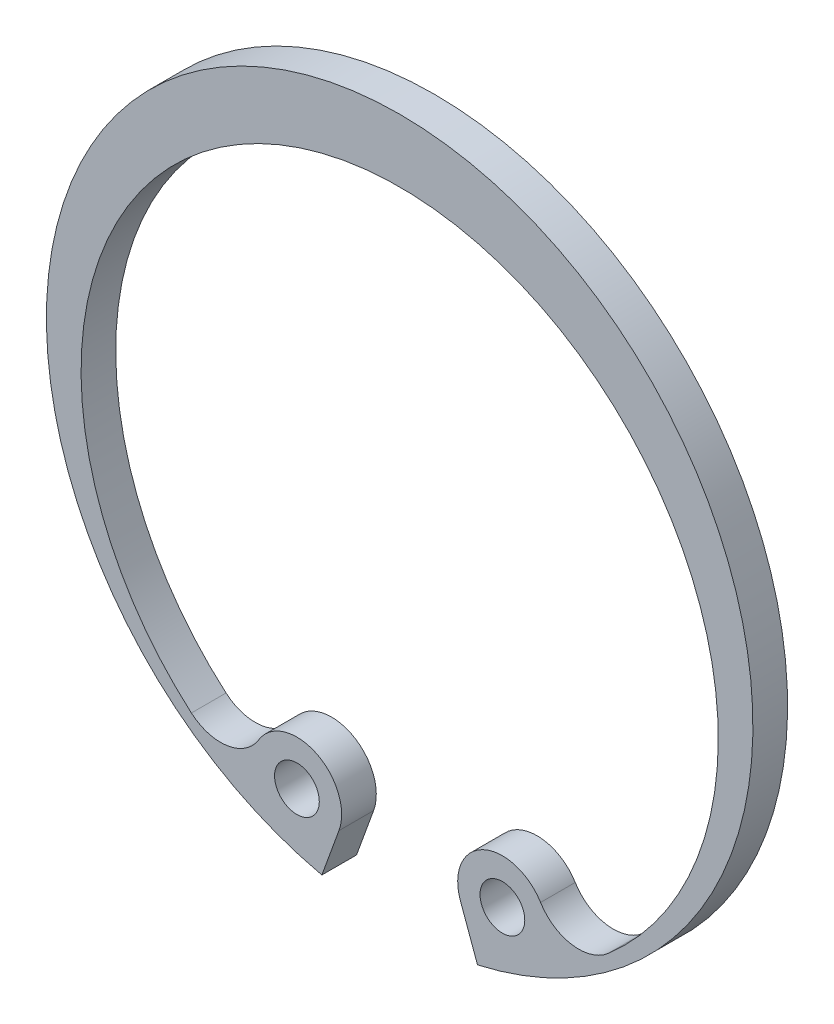
ISO-10303-21;
HEADER;
FILE_DESCRIPTION(('STEP AP214'),'2;1');
FILE_NAME('part.step','',(''),(''),'','','');
FILE_SCHEMA(('AUTOMOTIVE_DESIGN { 1 0 10303 214 1 1 1 1 }'));
ENDSEC;
DATA;
#1=APPLICATION_CONTEXT('core data for automotive mechanical design processes');
#2=APPLICATION_PROTOCOL_DEFINITION('international standard','automotive_design',2000,#1);
#3=PRODUCT_CONTEXT('',#1,'mechanical');
#4=PRODUCT('Part','Part','',(#3));
#5=PRODUCT_RELATED_PRODUCT_CATEGORY('part','',(#4));
#6=PRODUCT_DEFINITION_FORMATION('','',#4);
#7=PRODUCT_DEFINITION_CONTEXT('part definition',#1,'design');
#8=PRODUCT_DEFINITION('design','',#6,#7);
#9=PRODUCT_DEFINITION_SHAPE('','',#8);
#10=(LENGTH_UNIT() NAMED_UNIT(*) SI_UNIT(.MILLI.,.METRE.));
#11=(NAMED_UNIT(*) PLANE_ANGLE_UNIT() SI_UNIT($,.RADIAN.));
#12=(NAMED_UNIT(*) SI_UNIT($,.STERADIAN.) SOLID_ANGLE_UNIT());
#13=UNCERTAINTY_MEASURE_WITH_UNIT(LENGTH_MEASURE(1.E-05),#10,'distance_accuracy_value','');
#14=(GEOMETRIC_REPRESENTATION_CONTEXT(3) GLOBAL_UNCERTAINTY_ASSIGNED_CONTEXT((#13)) GLOBAL_UNIT_ASSIGNED_CONTEXT((#10,
#11,#12)) REPRESENTATION_CONTEXT('',''));
#15=CARTESIAN_POINT('',(0.,0.,0.));
#16=DIRECTION('',(0.,0.,1.));
#17=DIRECTION('',(1.,0.,0.));
#18=AXIS2_PLACEMENT_3D('',#15,#16,#17);
#19=CARTESIAN_POINT('',(0.,0.,0.775));
#20=DIRECTION('',(0.,0.,-1.));
#21=DIRECTION('',(-1.,0.,0.));
#22=AXIS2_PLACEMENT_3D('',#19,#20,#21);
#23=CYLINDRICAL_SURFACE('',#22,7.9);
#24=CARTESIAN_POINT('',(0.,0.,0.775));
#25=DIRECTION('',(0.,0.,-1.));
#26=DIRECTION('',(-1.,0.,0.));
#27=AXIS2_PLACEMENT_3D('',#24,#25,#26);
#28=CIRCLE('',#27,7.9);
#29=CARTESIAN_POINT('',(-1.74053225299461,-7.70587746309825,0.775));
#30=VERTEX_POINT('',#29);
#31=CARTESIAN_POINT('',(1.74053225299461,-7.70587746309825,0.775));
#32=VERTEX_POINT('',#31);
#33=EDGE_CURVE('E48',#30,#32,#28,.T.);
#34=ORIENTED_EDGE('',*,*,#33,.F.);
#35=DIRECTION('',(0.,0.,-1.));
#36=VECTOR('',#35,1.);
#37=CARTESIAN_POINT('',(-1.74053225299461,-7.70587746309825,1.55));
#38=LINE('',#37,#36);
#39=CARTESIAN_POINT('',(-1.74053225299461,-7.70587746309825,1.55));
#40=VERTEX_POINT('',#39);
#41=EDGE_CURVE('E11',#40,#30,#38,.T.);
#42=ORIENTED_EDGE('',*,*,#41,.F.);
#43=CARTESIAN_POINT('',(0.,0.,1.55));
#44=DIRECTION('',(0.,0.,1.));
#45=DIRECTION('',(1.,0.,0.));
#46=AXIS2_PLACEMENT_3D('',#43,#44,#45);
#47=CIRCLE('',#46,7.9);
#48=CARTESIAN_POINT('',(1.74053225299461,-7.70587746309825,1.55));
#49=VERTEX_POINT('',#48);
#50=EDGE_CURVE('E117',#49,#40,#47,.T.);
#51=ORIENTED_EDGE('',*,*,#50,.F.);
#52=DIRECTION('',(0.,0.,-1.));
#53=VECTOR('',#52,1.);
#54=CARTESIAN_POINT('',(1.74053225299461,-7.70587746309825,1.55));
#55=LINE('',#54,#53);
#56=EDGE_CURVE('E110',#49,#32,#55,.T.);
#57=ORIENTED_EDGE('',*,*,#56,.T.);
#58=EDGE_LOOP('',(#34,#42,#51,#57));
#59=FACE_BOUND('',#58,.T.);
#60=ADVANCED_FACE('F32',(#59),#23,.T.);
#61=CARTESIAN_POINT('',(0.,0.,1.55));
#62=DIRECTION('',(0.,0.,1.));
#63=DIRECTION('',(1.,0.,0.));
#64=AXIS2_PLACEMENT_3D('',#61,#62,#63);
#65=PLANE('',#64);
#66=CARTESIAN_POINT('',(2.29764108844284,-6.31271700850784,1.55));
#67=DIRECTION('',(0.,0.,1.));
#68=DIRECTION('',(1.,0.,0.));
#69=AXIS2_PLACEMENT_3D('',#66,#67,#68);
#70=CIRCLE('',#69,0.5);
#71=CARTESIAN_POINT('',(2.79764108844284,-6.31271700850784,1.55));
#72=VERTEX_POINT('',#71);
#73=EDGE_CURVE('E104',#72,#72,#70,.T.);
#74=ORIENTED_EDGE('',*,*,#73,.F.);
#75=EDGE_LOOP('',(#74));
#76=FACE_BOUND('',#75,.T.);
#77=ORIENTED_EDGE('',*,*,#50,.T.);
#78=DIRECTION('',(0.342020143325667,0.939692620785909,0.));
#79=VECTOR('',#78,1.);
#80=CARTESIAN_POINT('',(-1.35794846765694,-6.65473715183351,1.55));
#81=LINE('',#80,#79);
#82=CARTESIAN_POINT('',(-1.35794846765694,-6.65473715183351,1.55));
#83=VERTEX_POINT('',#82);
#84=EDGE_CURVE('E114',#40,#83,#81,.T.);
#85=ORIENTED_EDGE('',*,*,#84,.T.);
#86=CARTESIAN_POINT('',(-2.29764108844284,-6.31271700850784,1.55));
#87=DIRECTION('',(0.,0.,1.));
#88=DIRECTION('',(1.,0.,0.));
#89=AXIS2_PLACEMENT_3D('',#86,#87,#88);
#90=CIRCLE('',#89,0.999999999999999);
#91=CARTESIAN_POINT('',(-3.15093243026248,-5.7912825581925,1.55));
#92=VERTEX_POINT('',#91);
#93=EDGE_CURVE('E116',#83,#92,#90,.T.);
#94=ORIENTED_EDGE('',*,*,#93,.T.);
#95=CARTESIAN_POINT('',(-4.0042237720821,-5.26984810787717,1.55));
#96=DIRECTION('',(0.,0.,-1.));
#97=DIRECTION('',(1.,0.,0.));
#98=AXIS2_PLACEMENT_3D('',#95,#96,#97);
#99=CIRCLE('',#98,1.);
#100=CARTESIAN_POINT('',(-4.65797459201388,-6.02655800304078,1.55));
#101=VERTEX_POINT('',#100);
#102=EDGE_CURVE('E129',#92,#101,#99,.T.);
#103=ORIENTED_EDGE('',*,*,#102,.T.);
#104=CARTESIAN_POINT('',(0.,-0.635,1.55));
#105=DIRECTION('',(0.,0.,-1.));
#106=DIRECTION('',(1.,0.,0.));
#107=AXIS2_PLACEMENT_3D('',#104,#105,#106);
#108=CIRCLE('',#107,7.125);
#109=CARTESIAN_POINT('',(4.65797459201388,-6.02655800304079,1.55));
#110=VERTEX_POINT('',#109);
#111=EDGE_CURVE('E131',#101,#110,#108,.T.);
#112=ORIENTED_EDGE('',*,*,#111,.T.);
#113=CARTESIAN_POINT('',(4.0042237720821,-5.26984810787717,1.55));
#114=DIRECTION('',(0.,0.,-1.));
#115=DIRECTION('',(-1.,0.,0.));
#116=AXIS2_PLACEMENT_3D('',#113,#114,#115);
#117=CIRCLE('',#116,1.);
#118=CARTESIAN_POINT('',(3.15093243026248,-5.7912825581925,1.55));
#119=VERTEX_POINT('',#118);
#120=EDGE_CURVE('E133',#110,#119,#117,.T.);
#121=ORIENTED_EDGE('',*,*,#120,.T.);
#122=CARTESIAN_POINT('',(2.29764108844284,-6.31271700850784,1.55));
#123=DIRECTION('',(0.,0.,1.));
#124=DIRECTION('',(-1.,0.,0.));
#125=AXIS2_PLACEMENT_3D('',#122,#123,#124);
#126=CIRCLE('',#125,1.);
#127=CARTESIAN_POINT('',(1.35794846765694,-6.65473715183351,1.55));
#128=VERTEX_POINT('',#127);
#129=EDGE_CURVE('E135',#119,#128,#126,.T.);
#130=ORIENTED_EDGE('',*,*,#129,.T.);
#131=DIRECTION('',(0.342020143325669,-0.939692620785908,0.));
#132=VECTOR('',#131,1.);
#133=CARTESIAN_POINT('',(1.35794846765694,-6.65473715183351,1.55));
#134=LINE('',#133,#132);
#135=EDGE_CURVE('E56',#128,#49,#134,.T.);
#136=ORIENTED_EDGE('',*,*,#135,.T.);
#137=EDGE_LOOP('',(#77,#85,#94,#103,#112,#121,#130,#136));
#138=FACE_BOUND('',#137,.T.);
#139=CARTESIAN_POINT('',(-2.29764108844284,-6.31271700850784,1.55));
#140=DIRECTION('',(0.,0.,1.));
#141=DIRECTION('',(1.,0.,0.));
#142=AXIS2_PLACEMENT_3D('',#139,#140,#141);
#143=CIRCLE('',#142,0.5);
#144=CARTESIAN_POINT('',(-1.79764108844284,-6.31271700850784,1.55));
#145=VERTEX_POINT('',#144);
#146=EDGE_CURVE('E228',#145,#145,#143,.T.);
#147=ORIENTED_EDGE('',*,*,#146,.F.);
#148=EDGE_LOOP('',(#147));
#149=FACE_BOUND('',#148,.T.);
#150=ADVANCED_FACE('F119',(#76,#138,#149),#65,.T.);
#151=CARTESIAN_POINT('',(-1.35794846765694,-6.65473715183351,1.55));
#152=DIRECTION('',(-0.939692620785909,0.342020143325667,0.));
#153=DIRECTION('',(-0.342020143325667,-0.939692620785909,0.));
#154=AXIS2_PLACEMENT_3D('',#151,#152,#153);
#155=PLANE('',#154);
#156=DIRECTION('',(0.342020143325667,0.939692620785909,0.));
#157=VECTOR('',#156,1.);
#158=CARTESIAN_POINT('',(-1.35794846765694,-6.65473715183351,0.775));
#159=LINE('',#158,#157);
#160=CARTESIAN_POINT('',(-1.35794846765694,-6.65473715183351,0.775));
#161=VERTEX_POINT('',#160);
#162=EDGE_CURVE('E97',#30,#161,#159,.T.);
#163=ORIENTED_EDGE('',*,*,#162,.T.);
#164=DIRECTION('',(0.,0.,-1.));
#165=VECTOR('',#164,1.);
#166=CARTESIAN_POINT('',(-1.35794846765694,-6.65473715183351,1.55));
#167=LINE('',#166,#165);
#168=EDGE_CURVE('E40',#83,#161,#167,.T.);
#169=ORIENTED_EDGE('',*,*,#168,.F.);
#170=ORIENTED_EDGE('',*,*,#84,.F.);
#171=ORIENTED_EDGE('',*,*,#41,.T.);
#172=EDGE_LOOP('',(#163,#169,#170,#171));
#173=FACE_BOUND('',#172,.T.);
#174=ADVANCED_FACE('F113',(#173),#155,.F.);
#175=CARTESIAN_POINT('',(-2.29764108844284,-6.31271700850784,1.55));
#176=DIRECTION('',(0.,0.,-1.));
#177=DIRECTION('',(-1.,0.,0.));
#178=AXIS2_PLACEMENT_3D('',#175,#176,#177);
#179=CYLINDRICAL_SURFACE('',#178,0.999999999999999);
#180=CARTESIAN_POINT('',(-2.29764108844284,-6.31271700850784,0.775));
#181=DIRECTION('',(0.,0.,1.));
#182=DIRECTION('',(1.,0.,0.));
#183=AXIS2_PLACEMENT_3D('',#180,#181,#182);
#184=CIRCLE('',#183,0.999999999999999);
#185=CARTESIAN_POINT('',(-3.15093243026247,-5.7912825581925,0.775));
#186=VERTEX_POINT('',#185);
#187=EDGE_CURVE('E100',#161,#186,#184,.T.);
#188=ORIENTED_EDGE('',*,*,#187,.T.);
#189=DIRECTION('',(0.,0.,-1.));
#190=VECTOR('',#189,1.);
#191=CARTESIAN_POINT('',(-3.15093243026248,-5.7912825581925,1.55));
#192=LINE('',#191,#190);
#193=EDGE_CURVE('E171',#92,#186,#192,.T.);
#194=ORIENTED_EDGE('',*,*,#193,.F.);
#195=ORIENTED_EDGE('',*,*,#93,.F.);
#196=ORIENTED_EDGE('',*,*,#168,.T.);
#197=EDGE_LOOP('',(#188,#194,#195,#196));
#198=FACE_BOUND('',#197,.T.);
#199=ADVANCED_FACE('F177',(#198),#179,.T.);
#200=CARTESIAN_POINT('',(-4.0042237720821,-5.26984810787717,1.55));
#201=DIRECTION('',(0.,0.,-1.));
#202=DIRECTION('',(-1.,0.,0.));
#203=AXIS2_PLACEMENT_3D('',#200,#201,#202);
#204=CYLINDRICAL_SURFACE('',#203,1.);
#205=CARTESIAN_POINT('',(-4.0042237720821,-5.26984810787717,0.775));
#206=DIRECTION('',(0.,0.,-1.));
#207=DIRECTION('',(1.,0.,0.));
#208=AXIS2_PLACEMENT_3D('',#205,#206,#207);
#209=CIRCLE('',#208,1.);
#210=CARTESIAN_POINT('',(-4.65797459201388,-6.02655800304078,0.775));
#211=VERTEX_POINT('',#210);
#212=EDGE_CURVE('E139',#186,#211,#209,.T.);
#213=ORIENTED_EDGE('',*,*,#212,.T.);
#214=DIRECTION('',(0.,0.,-1.));
#215=VECTOR('',#214,1.);
#216=CARTESIAN_POINT('',(-4.65797459201388,-6.02655800304078,1.55));
#217=LINE('',#216,#215);
#218=EDGE_CURVE('E166',#101,#211,#217,.T.);
#219=ORIENTED_EDGE('',*,*,#218,.F.);
#220=ORIENTED_EDGE('',*,*,#102,.F.);
#221=ORIENTED_EDGE('',*,*,#193,.T.);
#222=EDGE_LOOP('',(#213,#219,#220,#221));
#223=FACE_BOUND('',#222,.T.);
#224=ADVANCED_FACE('F184',(#223),#204,.F.);
#225=CARTESIAN_POINT('',(0.,-0.635,1.55));
#226=DIRECTION('',(0.,0.,-1.));
#227=DIRECTION('',(-1.,0.,0.));
#228=AXIS2_PLACEMENT_3D('',#225,#226,#227);
#229=CYLINDRICAL_SURFACE('',#228,7.125);
#230=CARTESIAN_POINT('',(0.,-0.635,0.775));
#231=DIRECTION('',(0.,0.,-1.));
#232=DIRECTION('',(1.,0.,0.));
#233=AXIS2_PLACEMENT_3D('',#230,#231,#232);
#234=CIRCLE('',#233,7.125);
#235=CARTESIAN_POINT('',(4.65797459201388,-6.02655800304078,0.775));
#236=VERTEX_POINT('',#235);
#237=EDGE_CURVE('E142',#211,#236,#234,.T.);
#238=ORIENTED_EDGE('',*,*,#237,.T.);
#239=DIRECTION('',(0.,0.,-1.));
#240=VECTOR('',#239,1.);
#241=CARTESIAN_POINT('',(4.65797459201388,-6.02655800304079,1.55));
#242=LINE('',#241,#240);
#243=EDGE_CURVE('E161',#110,#236,#242,.T.);
#244=ORIENTED_EDGE('',*,*,#243,.F.);
#245=ORIENTED_EDGE('',*,*,#111,.F.);
#246=ORIENTED_EDGE('',*,*,#218,.T.);
#247=EDGE_LOOP('',(#238,#244,#245,#246));
#248=FACE_BOUND('',#247,.T.);
#249=ADVANCED_FACE('F186',(#248),#229,.F.);
#250=CARTESIAN_POINT('',(4.0042237720821,-5.26984810787717,1.55));
#251=DIRECTION('',(0.,0.,-1.));
#252=DIRECTION('',(-1.,0.,0.));
#253=AXIS2_PLACEMENT_3D('',#250,#251,#252);
#254=CYLINDRICAL_SURFACE('',#253,1.);
#255=CARTESIAN_POINT('',(4.0042237720821,-5.26984810787717,0.775));
#256=DIRECTION('',(0.,0.,-1.));
#257=DIRECTION('',(-1.,0.,0.));
#258=AXIS2_PLACEMENT_3D('',#255,#256,#257);
#259=CIRCLE('',#258,1.);
#260=CARTESIAN_POINT('',(3.15093243026247,-5.7912825581925,0.775));
#261=VERTEX_POINT('',#260);
#262=EDGE_CURVE('E145',#236,#261,#259,.T.);
#263=ORIENTED_EDGE('',*,*,#262,.T.);
#264=DIRECTION('',(0.,0.,-1.));
#265=VECTOR('',#264,1.);
#266=CARTESIAN_POINT('',(3.15093243026248,-5.7912825581925,1.55));
#267=LINE('',#266,#265);
#268=EDGE_CURVE('E157',#119,#261,#267,.T.);
#269=ORIENTED_EDGE('',*,*,#268,.F.);
#270=ORIENTED_EDGE('',*,*,#120,.F.);
#271=ORIENTED_EDGE('',*,*,#243,.T.);
#272=EDGE_LOOP('',(#263,#269,#270,#271));
#273=FACE_BOUND('',#272,.T.);
#274=ADVANCED_FACE('F189',(#273),#254,.F.);
#275=CARTESIAN_POINT('',(2.29764108844284,-6.31271700850784,1.55));
#276=DIRECTION('',(0.,0.,-1.));
#277=DIRECTION('',(-1.,0.,0.));
#278=AXIS2_PLACEMENT_3D('',#275,#276,#277);
#279=CYLINDRICAL_SURFACE('',#278,1.);
#280=CARTESIAN_POINT('',(2.29764108844284,-6.31271700850784,0.775));
#281=DIRECTION('',(0.,0.,1.));
#282=DIRECTION('',(-1.,0.,0.));
#283=AXIS2_PLACEMENT_3D('',#280,#281,#282);
#284=CIRCLE('',#283,1.);
#285=CARTESIAN_POINT('',(1.35794846765694,-6.65473715183351,0.775));
#286=VERTEX_POINT('',#285);
#287=EDGE_CURVE('E123',#261,#286,#284,.T.);
#288=ORIENTED_EDGE('',*,*,#287,.T.);
#289=DIRECTION('',(0.,0.,-1.));
#290=VECTOR('',#289,1.);
#291=CARTESIAN_POINT('',(1.35794846765694,-6.65473715183351,1.55));
#292=LINE('',#291,#290);
#293=EDGE_CURVE('E152',#128,#286,#292,.T.);
#294=ORIENTED_EDGE('',*,*,#293,.F.);
#295=ORIENTED_EDGE('',*,*,#129,.F.);
#296=ORIENTED_EDGE('',*,*,#268,.T.);
#297=EDGE_LOOP('',(#288,#294,#295,#296));
#298=FACE_BOUND('',#297,.T.);
#299=ADVANCED_FACE('F190',(#298),#279,.T.);
#300=CARTESIAN_POINT('',(1.35794846765694,-6.65473715183351,1.55));
#301=DIRECTION('',(0.939692620785908,0.342020143325669,0.));
#302=DIRECTION('',(-0.342020143325669,0.939692620785908,0.));
#303=AXIS2_PLACEMENT_3D('',#300,#301,#302);
#304=PLANE('',#303);
#305=DIRECTION('',(0.342020143325669,-0.939692620785908,0.));
#306=VECTOR('',#305,1.);
#307=CARTESIAN_POINT('',(1.35794846765694,-6.65473715183351,0.775));
#308=LINE('',#307,#306);
#309=EDGE_CURVE('E121',#286,#32,#308,.T.);
#310=ORIENTED_EDGE('',*,*,#309,.T.);
#311=ORIENTED_EDGE('',*,*,#56,.F.);
#312=ORIENTED_EDGE('',*,*,#135,.F.);
#313=ORIENTED_EDGE('',*,*,#293,.T.);
#314=EDGE_LOOP('',(#310,#311,#312,#313));
#315=FACE_BOUND('',#314,.T.);
#316=ADVANCED_FACE('F191',(#315),#304,.F.);
#317=CARTESIAN_POINT('',(2.29764108844284,-6.31271700850784,1.55));
#318=DIRECTION('',(0.,0.,-1.));
#319=DIRECTION('',(-1.,0.,0.));
#320=AXIS2_PLACEMENT_3D('',#317,#318,#319);
#321=CYLINDRICAL_SURFACE('',#320,0.5);
#322=ORIENTED_EDGE('',*,*,#73,.T.);
#323=EDGE_LOOP('',(#322));
#324=FACE_BOUND('',#323,.T.);
#325=CARTESIAN_POINT('',(2.29764108844284,-6.31271700850784,0.775));
#326=DIRECTION('',(0.,0.,-1.));
#327=DIRECTION('',(-1.,0.,0.));
#328=AXIS2_PLACEMENT_3D('',#325,#326,#327);
#329=CIRCLE('',#328,0.5);
#330=CARTESIAN_POINT('',(1.79764108844284,-6.31271700850784,0.775));
#331=VERTEX_POINT('',#330);
#332=EDGE_CURVE('E226',#331,#331,#329,.T.);
#333=ORIENTED_EDGE('',*,*,#332,.T.);
#334=EDGE_LOOP('',(#333));
#335=FACE_BOUND('',#334,.T.);
#336=ADVANCED_FACE('F193',(#324,#335),#321,.F.);
#337=CARTESIAN_POINT('',(-2.29764108844284,-6.31271700850784,1.55));
#338=DIRECTION('',(0.,0.,-1.));
#339=DIRECTION('',(-1.,0.,0.));
#340=AXIS2_PLACEMENT_3D('',#337,#338,#339);
#341=CYLINDRICAL_SURFACE('',#340,0.5);
#342=ORIENTED_EDGE('',*,*,#146,.T.);
#343=EDGE_LOOP('',(#342));
#344=FACE_BOUND('',#343,.T.);
#345=CARTESIAN_POINT('',(-2.29764108844284,-6.31271700850784,0.775));
#346=DIRECTION('',(0.,0.,-1.));
#347=DIRECTION('',(-1.,0.,0.));
#348=AXIS2_PLACEMENT_3D('',#345,#346,#347);
#349=CIRCLE('',#348,0.5);
#350=CARTESIAN_POINT('',(-2.79764108844285,-6.31271700850784,0.775));
#351=VERTEX_POINT('',#350);
#352=EDGE_CURVE('E111',#351,#351,#349,.T.);
#353=ORIENTED_EDGE('',*,*,#352,.T.);
#354=EDGE_LOOP('',(#353));
#355=FACE_BOUND('',#354,.T.);
#356=ADVANCED_FACE('F199',(#344,#355),#341,.F.);
#357=CARTESIAN_POINT('',(0.,0.,0.775));
#358=DIRECTION('',(0.,0.,-1.));
#359=DIRECTION('',(-1.,0.,0.));
#360=AXIS2_PLACEMENT_3D('',#357,#358,#359);
#361=PLANE('',#360);
#362=ORIENTED_EDGE('',*,*,#352,.F.);
#363=EDGE_LOOP('',(#362));
#364=FACE_BOUND('',#363,.T.);
#365=ORIENTED_EDGE('',*,*,#332,.F.);
#366=EDGE_LOOP('',(#365));
#367=FACE_BOUND('',#366,.T.);
#368=ORIENTED_EDGE('',*,*,#162,.F.);
#369=ORIENTED_EDGE('',*,*,#33,.T.);
#370=ORIENTED_EDGE('',*,*,#309,.F.);
#371=ORIENTED_EDGE('',*,*,#287,.F.);
#372=ORIENTED_EDGE('',*,*,#262,.F.);
#373=ORIENTED_EDGE('',*,*,#237,.F.);
#374=ORIENTED_EDGE('',*,*,#212,.F.);
#375=ORIENTED_EDGE('',*,*,#187,.F.);
#376=EDGE_LOOP('',(#368,#369,#370,#371,#372,#373,#374,#375));
#377=FACE_BOUND('',#376,.T.);
#378=ADVANCED_FACE('F98',(#364,#367,#377),#361,.T.);
#379=CLOSED_SHELL('',(#60,#150,#174,#199,#224,#249,#274,#299,#316,#336,#356,#378));
#380=MANIFOLD_SOLID_BREP('B2',#379);
#381=ADVANCED_BREP_SHAPE_REPRESENTATION('',(#18,#380),#14);
#382=SHAPE_DEFINITION_REPRESENTATION(#9,#381);
ENDSEC;
END-ISO-10303-21;
